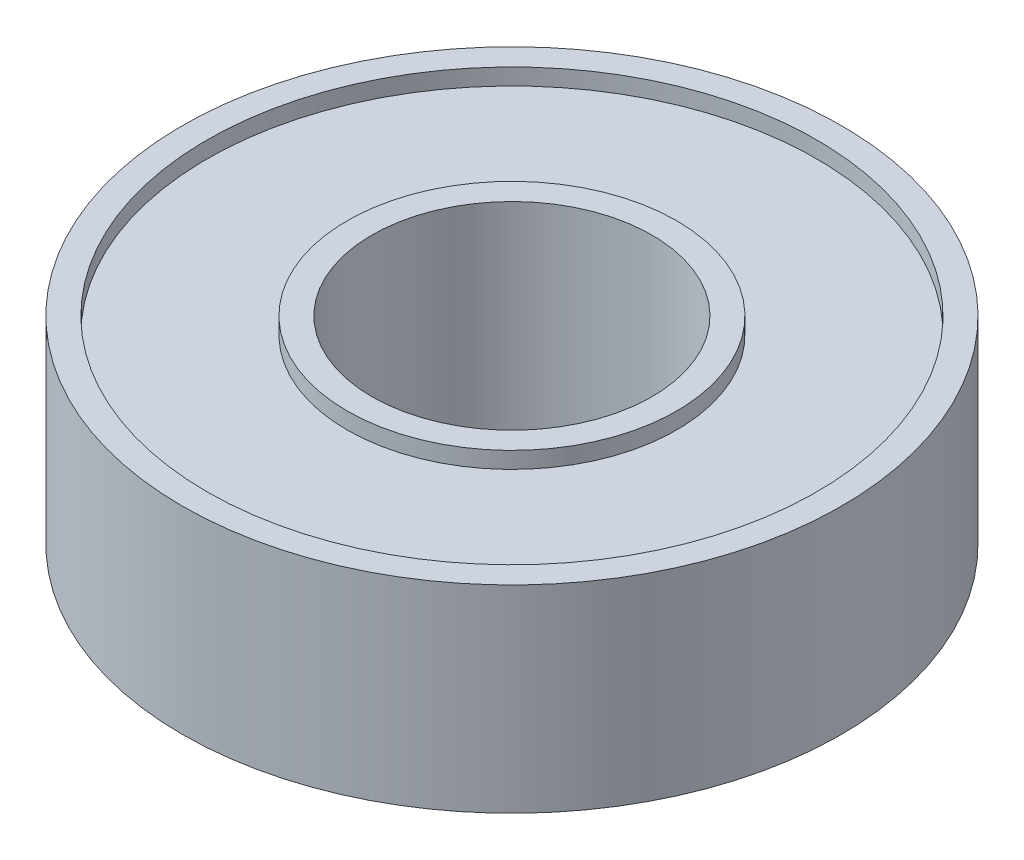
ISO-10303-21;
HEADER;
FILE_DESCRIPTION(('STEP AP214'),'2;1');
FILE_NAME('part.step','',(''),(''),'','','');
FILE_SCHEMA(('AUTOMOTIVE_DESIGN { 1 0 10303 214 1 1 1 1 }'));
ENDSEC;
DATA;
#1=APPLICATION_CONTEXT('core data for automotive mechanical design processes');
#2=APPLICATION_PROTOCOL_DEFINITION('international standard','automotive_design',2000,#1);
#3=PRODUCT_CONTEXT('',#1,'mechanical');
#4=PRODUCT('Part','Part','',(#3));
#5=PRODUCT_RELATED_PRODUCT_CATEGORY('part','',(#4));
#6=PRODUCT_DEFINITION_FORMATION('','',#4);
#7=PRODUCT_DEFINITION_CONTEXT('part definition',#1,'design');
#8=PRODUCT_DEFINITION('design','',#6,#7);
#9=PRODUCT_DEFINITION_SHAPE('','',#8);
#10=(LENGTH_UNIT() NAMED_UNIT(*) SI_UNIT(.MILLI.,.METRE.));
#11=(NAMED_UNIT(*) PLANE_ANGLE_UNIT() SI_UNIT($,.RADIAN.));
#12=(NAMED_UNIT(*) SI_UNIT($,.STERADIAN.) SOLID_ANGLE_UNIT());
#13=UNCERTAINTY_MEASURE_WITH_UNIT(LENGTH_MEASURE(1.E-05),#10,'distance_accuracy_value','');
#14=(GEOMETRIC_REPRESENTATION_CONTEXT(3) GLOBAL_UNCERTAINTY_ASSIGNED_CONTEXT((#13)) GLOBAL_UNIT_ASSIGNED_CONTEXT((#10,
#11,#12)) REPRESENTATION_CONTEXT('',''));
#15=CARTESIAN_POINT('',(0.,0.,0.));
#16=DIRECTION('',(0.,0.,1.));
#17=DIRECTION('',(1.,0.,0.));
#18=AXIS2_PLACEMENT_3D('',#15,#16,#17);
#19=CARTESIAN_POINT('',(0.,0.,0.));
#20=DIRECTION('',(0.,1.,0.));
#21=DIRECTION('',(0.,0.,1.));
#22=AXIS2_PLACEMENT_3D('',#19,#20,#21);
#23=PLANE('',#22);
#24=CARTESIAN_POINT('',(0.,0.,0.));
#25=DIRECTION('',(0.,1.,0.));
#26=DIRECTION('',(0.,0.,1.));
#27=AXIS2_PLACEMENT_3D('',#24,#25,#26);
#28=CIRCLE('',#27,8.5);
#29=CARTESIAN_POINT('',(0.,0.,8.5));
#30=VERTEX_POINT('',#29);
#31=EDGE_CURVE('E45',#30,#30,#28,.T.);
#32=ORIENTED_EDGE('',*,*,#31,.T.);
#33=EDGE_LOOP('',(#32));
#34=FACE_BOUND('',#33,.T.);
#35=CARTESIAN_POINT('',(0.,0.,0.));
#36=DIRECTION('',(0.,-1.,0.));
#37=DIRECTION('',(0.,0.,-1.));
#38=AXIS2_PLACEMENT_3D('',#35,#36,#37);
#39=CIRCLE('',#38,10.);
#40=CARTESIAN_POINT('',(0.,0.,-10.));
#41=VERTEX_POINT('',#40);
#42=EDGE_CURVE('E69',#41,#41,#39,.T.);
#43=ORIENTED_EDGE('',*,*,#42,.T.);
#44=EDGE_LOOP('',(#43));
#45=FACE_BOUND('',#44,.T.);
#46=ADVANCED_FACE('F32',(#34,#45),#23,.F.);
#47=CARTESIAN_POINT('',(0.,12.,0.));
#48=DIRECTION('',(0.,1.,0.));
#49=DIRECTION('',(0.,0.,1.));
#50=AXIS2_PLACEMENT_3D('',#47,#48,#49);
#51=PLANE('',#50);
#52=CARTESIAN_POINT('',(0.,12.,0.));
#53=DIRECTION('',(0.,1.,0.));
#54=DIRECTION('',(0.,0.,1.));
#55=AXIS2_PLACEMENT_3D('',#52,#53,#54);
#56=CIRCLE('',#55,8.5);
#57=CARTESIAN_POINT('',(0.,12.,8.5));
#58=VERTEX_POINT('',#57);
#59=EDGE_CURVE('E43',#58,#58,#56,.T.);
#60=ORIENTED_EDGE('',*,*,#59,.F.);
#61=EDGE_LOOP('',(#60));
#62=FACE_BOUND('',#61,.T.);
#63=CARTESIAN_POINT('',(0.,12.,0.));
#64=DIRECTION('',(0.,1.,0.));
#65=DIRECTION('',(0.,0.,1.));
#66=AXIS2_PLACEMENT_3D('',#63,#64,#65);
#67=CIRCLE('',#66,10.);
#68=CARTESIAN_POINT('',(0.,12.,10.));
#69=VERTEX_POINT('',#68);
#70=EDGE_CURVE('E57',#69,#69,#67,.T.);
#71=ORIENTED_EDGE('',*,*,#70,.T.);
#72=EDGE_LOOP('',(#71));
#73=FACE_BOUND('',#72,.T.);
#74=ADVANCED_FACE('F107',(#62,#73),#51,.T.);
#75=CARTESIAN_POINT('',(0.,12.,0.));
#76=DIRECTION('',(0.,1.,0.));
#77=DIRECTION('',(0.,0.,1.));
#78=AXIS2_PLACEMENT_3D('',#75,#76,#77);
#79=CIRCLE('',#78,18.5);
#80=CARTESIAN_POINT('',(0.,12.,18.5));
#81=VERTEX_POINT('',#80);
#82=EDGE_CURVE('E51',#81,#81,#79,.T.);
#83=ORIENTED_EDGE('',*,*,#82,.F.);
#84=EDGE_LOOP('',(#83));
#85=FACE_BOUND('',#84,.T.);
#86=CARTESIAN_POINT('',(0.,12.,0.));
#87=DIRECTION('',(0.,1.,0.));
#88=DIRECTION('',(0.,0.,1.));
#89=AXIS2_PLACEMENT_3D('',#86,#87,#88);
#90=CIRCLE('',#89,20.);
#91=CARTESIAN_POINT('',(0.,12.,20.));
#92=VERTEX_POINT('',#91);
#93=EDGE_CURVE('E10',#92,#92,#90,.T.);
#94=ORIENTED_EDGE('',*,*,#93,.T.);
#95=EDGE_LOOP('',(#94));
#96=FACE_BOUND('',#95,.T.);
#97=ADVANCED_FACE('F94',(#85,#96),#51,.T.);
#98=CARTESIAN_POINT('',(0.,0.,0.));
#99=DIRECTION('',(0.,-1.,0.));
#100=DIRECTION('',(0.,0.,-1.));
#101=AXIS2_PLACEMENT_3D('',#98,#99,#100);
#102=CIRCLE('',#101,18.5);
#103=CARTESIAN_POINT('',(0.,0.,-18.5));
#104=VERTEX_POINT('',#103);
#105=EDGE_CURVE('E63',#104,#104,#102,.T.);
#106=ORIENTED_EDGE('',*,*,#105,.F.);
#107=EDGE_LOOP('',(#106));
#108=FACE_BOUND('',#107,.T.);
#109=CARTESIAN_POINT('',(0.,0.,0.));
#110=DIRECTION('',(0.,1.,0.));
#111=DIRECTION('',(0.,0.,1.));
#112=AXIS2_PLACEMENT_3D('',#109,#110,#111);
#113=CIRCLE('',#112,20.);
#114=CARTESIAN_POINT('',(0.,0.,20.));
#115=VERTEX_POINT('',#114);
#116=EDGE_CURVE('E36',#115,#115,#113,.T.);
#117=ORIENTED_EDGE('',*,*,#116,.F.);
#118=EDGE_LOOP('',(#117));
#119=FACE_BOUND('',#118,.T.);
#120=ADVANCED_FACE('F91',(#108,#119),#23,.F.);
#121=CARTESIAN_POINT('',(0.,12.,0.));
#122=DIRECTION('',(0.,-1.,0.));
#123=DIRECTION('',(0.,0.,-1.));
#124=AXIS2_PLACEMENT_3D('',#121,#122,#123);
#125=CYLINDRICAL_SURFACE('',#124,20.);
#126=ORIENTED_EDGE('',*,*,#93,.F.);
#127=EDGE_LOOP('',(#126));
#128=FACE_BOUND('',#127,.T.);
#129=ORIENTED_EDGE('',*,*,#116,.T.);
#130=EDGE_LOOP('',(#129));
#131=FACE_BOUND('',#130,.T.);
#132=ADVANCED_FACE('F34',(#128,#131),#125,.T.);
#133=CARTESIAN_POINT('',(0.,12.,0.));
#134=DIRECTION('',(0.,-1.,0.));
#135=DIRECTION('',(0.,0.,-1.));
#136=AXIS2_PLACEMENT_3D('',#133,#134,#135);
#137=CYLINDRICAL_SURFACE('',#136,8.5);
#138=ORIENTED_EDGE('',*,*,#59,.T.);
#139=EDGE_LOOP('',(#138));
#140=FACE_BOUND('',#139,.T.);
#141=ORIENTED_EDGE('',*,*,#31,.F.);
#142=EDGE_LOOP('',(#141));
#143=FACE_BOUND('',#142,.T.);
#144=ADVANCED_FACE('F98',(#140,#143),#137,.F.);
#145=CARTESIAN_POINT('',(0.,11.,0.));
#146=DIRECTION('',(0.,1.,0.));
#147=DIRECTION('',(0.,0.,1.));
#148=AXIS2_PLACEMENT_3D('',#145,#146,#147);
#149=CYLINDRICAL_SURFACE('',#148,18.5);
#150=CARTESIAN_POINT('',(0.,11.,0.));
#151=DIRECTION('',(0.,1.,0.));
#152=DIRECTION('',(0.,0.,1.));
#153=AXIS2_PLACEMENT_3D('',#150,#151,#152);
#154=CIRCLE('',#153,18.5);
#155=CARTESIAN_POINT('',(0.,11.,18.5));
#156=VERTEX_POINT('',#155);
#157=EDGE_CURVE('E48',#156,#156,#154,.T.);
#158=ORIENTED_EDGE('',*,*,#157,.F.);
#159=EDGE_LOOP('',(#158));
#160=FACE_BOUND('',#159,.T.);
#161=ORIENTED_EDGE('',*,*,#82,.T.);
#162=EDGE_LOOP('',(#161));
#163=FACE_BOUND('',#162,.T.);
#164=ADVANCED_FACE('F103',(#160,#163),#149,.F.);
#165=CARTESIAN_POINT('',(0.,11.,0.));
#166=DIRECTION('',(0.,1.,0.));
#167=DIRECTION('',(0.,0.,1.));
#168=AXIS2_PLACEMENT_3D('',#165,#166,#167);
#169=PLANE('',#168);
#170=CARTESIAN_POINT('',(0.,11.,0.));
#171=DIRECTION('',(0.,1.,0.));
#172=DIRECTION('',(0.,0.,1.));
#173=AXIS2_PLACEMENT_3D('',#170,#171,#172);
#174=CIRCLE('',#173,10.);
#175=CARTESIAN_POINT('',(0.,11.,10.));
#176=VERTEX_POINT('',#175);
#177=EDGE_CURVE('E54',#176,#176,#174,.T.);
#178=ORIENTED_EDGE('',*,*,#177,.F.);
#179=EDGE_LOOP('',(#178));
#180=FACE_BOUND('',#179,.T.);
#181=ORIENTED_EDGE('',*,*,#157,.T.);
#182=EDGE_LOOP('',(#181));
#183=FACE_BOUND('',#182,.T.);
#184=ADVANCED_FACE('F120',(#180,#183),#169,.T.);
#185=CARTESIAN_POINT('',(0.,11.,0.));
#186=DIRECTION('',(0.,1.,0.));
#187=DIRECTION('',(0.,0.,1.));
#188=AXIS2_PLACEMENT_3D('',#185,#186,#187);
#189=CYLINDRICAL_SURFACE('',#188,10.);
#190=ORIENTED_EDGE('',*,*,#177,.T.);
#191=EDGE_LOOP('',(#190));
#192=FACE_BOUND('',#191,.T.);
#193=ORIENTED_EDGE('',*,*,#70,.F.);
#194=EDGE_LOOP('',(#193));
#195=FACE_BOUND('',#194,.T.);
#196=ADVANCED_FACE('F87',(#192,#195),#189,.T.);
#197=CARTESIAN_POINT('',(0.,1.,0.));
#198=DIRECTION('',(0.,-1.,0.));
#199=DIRECTION('',(0.,0.,-1.));
#200=AXIS2_PLACEMENT_3D('',#197,#198,#199);
#201=CYLINDRICAL_SURFACE('',#200,18.5);
#202=CARTESIAN_POINT('',(0.,1.,0.));
#203=DIRECTION('',(0.,-1.,0.));
#204=DIRECTION('',(0.,0.,-1.));
#205=AXIS2_PLACEMENT_3D('',#202,#203,#204);
#206=CIRCLE('',#205,18.5);
#207=CARTESIAN_POINT('',(0.,1.,-18.5));
#208=VERTEX_POINT('',#207);
#209=EDGE_CURVE('E60',#208,#208,#206,.T.);
#210=ORIENTED_EDGE('',*,*,#209,.F.);
#211=EDGE_LOOP('',(#210));
#212=FACE_BOUND('',#211,.T.);
#213=ORIENTED_EDGE('',*,*,#105,.T.);
#214=EDGE_LOOP('',(#213));
#215=FACE_BOUND('',#214,.T.);
#216=ADVANCED_FACE('F81',(#212,#215),#201,.F.);
#217=CARTESIAN_POINT('',(0.,1.,0.));
#218=DIRECTION('',(0.,-1.,0.));
#219=DIRECTION('',(0.,0.,-1.));
#220=AXIS2_PLACEMENT_3D('',#217,#218,#219);
#221=PLANE('',#220);
#222=CARTESIAN_POINT('',(0.,1.,0.));
#223=DIRECTION('',(0.,-1.,0.));
#224=DIRECTION('',(0.,0.,-1.));
#225=AXIS2_PLACEMENT_3D('',#222,#223,#224);
#226=CIRCLE('',#225,10.);
#227=CARTESIAN_POINT('',(0.,1.,-10.));
#228=VERTEX_POINT('',#227);
#229=EDGE_CURVE('E66',#228,#228,#226,.T.);
#230=ORIENTED_EDGE('',*,*,#229,.F.);
#231=EDGE_LOOP('',(#230));
#232=FACE_BOUND('',#231,.T.);
#233=ORIENTED_EDGE('',*,*,#209,.T.);
#234=EDGE_LOOP('',(#233));
#235=FACE_BOUND('',#234,.T.);
#236=ADVANCED_FACE('F78',(#232,#235),#221,.T.);
#237=CARTESIAN_POINT('',(0.,1.,0.));
#238=DIRECTION('',(0.,-1.,0.));
#239=DIRECTION('',(0.,0.,-1.));
#240=AXIS2_PLACEMENT_3D('',#237,#238,#239);
#241=CYLINDRICAL_SURFACE('',#240,10.);
#242=ORIENTED_EDGE('',*,*,#229,.T.);
#243=EDGE_LOOP('',(#242));
#244=FACE_BOUND('',#243,.T.);
#245=ORIENTED_EDGE('',*,*,#42,.F.);
#246=EDGE_LOOP('',(#245));
#247=FACE_BOUND('',#246,.T.);
#248=ADVANCED_FACE('F75',(#244,#247),#241,.T.);
#249=CLOSED_SHELL('',(#46,#74,#97,#120,#132,#144,#164,#184,#196,#216,#236,#248));
#250=MANIFOLD_SOLID_BREP('B2',#249);
#251=ADVANCED_BREP_SHAPE_REPRESENTATION('',(#18,#250),#14);
#252=SHAPE_DEFINITION_REPRESENTATION(#9,#251);
ENDSEC;
END-ISO-10303-21;
